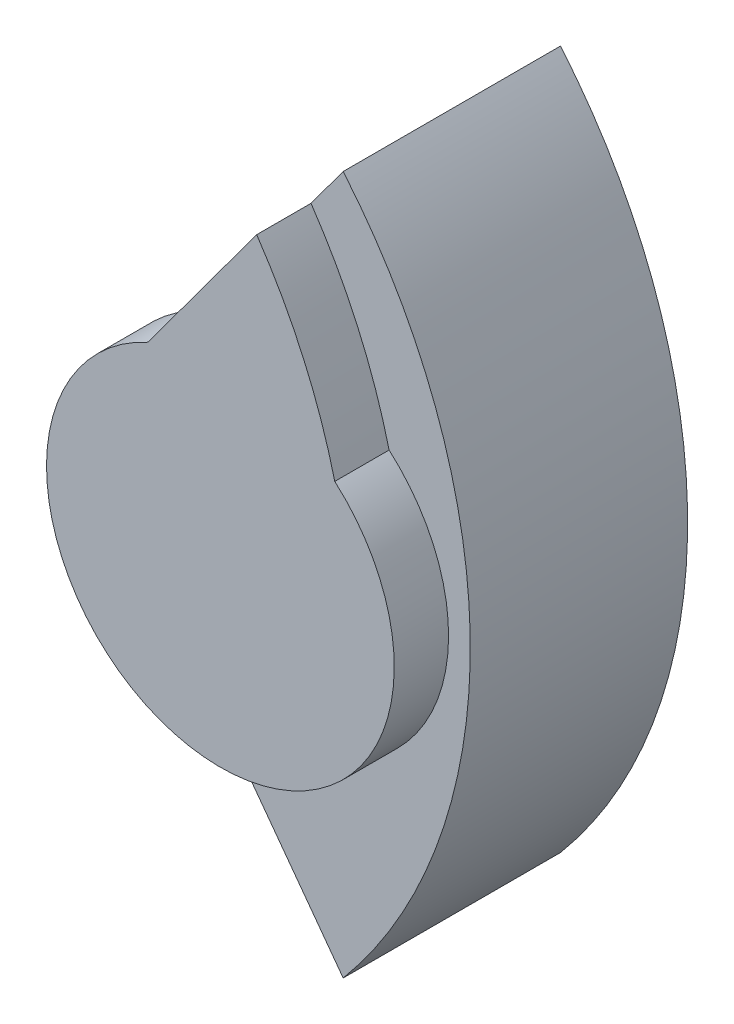
ISO-10303-21;
HEADER;
FILE_DESCRIPTION(('STEP AP214'),'2;1');
FILE_NAME('part.step','',(''),(''),'','','');
FILE_SCHEMA(('AUTOMOTIVE_DESIGN { 1 0 10303 214 1 1 1 1 }'));
ENDSEC;
DATA;
#1=APPLICATION_CONTEXT('core data for automotive mechanical design processes');
#2=APPLICATION_PROTOCOL_DEFINITION('international standard','automotive_design',2000,#1);
#3=PRODUCT_CONTEXT('',#1,'mechanical');
#4=PRODUCT('Part','Part','',(#3));
#5=PRODUCT_RELATED_PRODUCT_CATEGORY('part','',(#4));
#6=PRODUCT_DEFINITION_FORMATION('','',#4);
#7=PRODUCT_DEFINITION_CONTEXT('part definition',#1,'design');
#8=PRODUCT_DEFINITION('design','',#6,#7);
#9=PRODUCT_DEFINITION_SHAPE('','',#8);
#10=(LENGTH_UNIT() NAMED_UNIT(*) SI_UNIT(.MILLI.,.METRE.));
#11=(NAMED_UNIT(*) PLANE_ANGLE_UNIT() SI_UNIT($,.RADIAN.));
#12=(NAMED_UNIT(*) SI_UNIT($,.STERADIAN.) SOLID_ANGLE_UNIT());
#13=UNCERTAINTY_MEASURE_WITH_UNIT(LENGTH_MEASURE(1.E-05),#10,'distance_accuracy_value','');
#14=(GEOMETRIC_REPRESENTATION_CONTEXT(3) GLOBAL_UNCERTAINTY_ASSIGNED_CONTEXT((#13)) GLOBAL_UNIT_ASSIGNED_CONTEXT((#10,
#11,#12)) REPRESENTATION_CONTEXT('',''));
#15=CARTESIAN_POINT('',(0.,0.,0.));
#16=DIRECTION('',(0.,0.,1.));
#17=DIRECTION('',(1.,0.,0.));
#18=AXIS2_PLACEMENT_3D('',#15,#16,#17);
#19=CARTESIAN_POINT('',(32.,0.,5.));
#20=DIRECTION('',(0.,0.,-1.));
#21=DIRECTION('',(-1.,0.,0.));
#22=AXIS2_PLACEMENT_3D('',#19,#20,#21);
#23=CYLINDRICAL_SURFACE('',#22,14.);
#24=CARTESIAN_POINT('',(32.,0.,-20.));
#25=DIRECTION('',(0.,0.,1.));
#26=DIRECTION('',(1.,0.,0.));
#27=AXIS2_PLACEMENT_3D('',#24,#25,#26);
#28=CIRCLE('',#27,14.);
#29=CARTESIAN_POINT('',(46.,0.,-20.));
#30=VERTEX_POINT('',#29);
#31=EDGE_CURVE('E161',#30,#30,#28,.T.);
#32=ORIENTED_EDGE('',*,*,#31,.T.);
#33=EDGE_LOOP('',(#32));
#34=FACE_BOUND('',#33,.T.);
#35=CARTESIAN_POINT('',(32.,0.,0.));
#36=DIRECTION('',(0.,0.,1.));
#37=DIRECTION('',(1.,0.,0.));
#38=AXIS2_PLACEMENT_3D('',#35,#36,#37);
#39=CIRCLE('',#38,14.);
#40=CARTESIAN_POINT('',(20.731628295356,8.30805627845521,0.));
#41=VERTEX_POINT('',#40);
#42=CARTESIAN_POINT('',(20.731628295356,-8.30805627845521,0.));
#43=VERTEX_POINT('',#42);
#44=EDGE_CURVE('E147',#41,#43,#39,.T.);
#45=ORIENTED_EDGE('',*,*,#44,.F.);
#46=DIRECTION('',(0.,0.,1.));
#47=VECTOR('',#46,1.);
#48=CARTESIAN_POINT('',(20.731628295356,8.30805627845521,-3.));
#49=LINE('',#48,#47);
#50=CARTESIAN_POINT('',(20.731628295356,8.30805627845521,-3.));
#51=VERTEX_POINT('',#50);
#52=EDGE_CURVE('E211',#51,#41,#49,.T.);
#53=ORIENTED_EDGE('',*,*,#52,.F.);
#54=CARTESIAN_POINT('',(32.,0.,-3.));
#55=DIRECTION('',(0.,0.,1.));
#56=DIRECTION('',(1.,0.,0.));
#57=AXIS2_PLACEMENT_3D('',#54,#55,#56);
#58=CIRCLE('',#57,14.);
#59=CARTESIAN_POINT('',(20.731628295356,-8.30805627845521,-3.));
#60=VERTEX_POINT('',#59);
#61=EDGE_CURVE('E165',#60,#51,#58,.T.);
#62=ORIENTED_EDGE('',*,*,#61,.F.);
#63=DIRECTION('',(0.,0.,1.));
#64=VECTOR('',#63,1.);
#65=CARTESIAN_POINT('',(20.731628295356,-8.30805627845521,-3.));
#66=LINE('',#65,#64);
#67=EDGE_CURVE('E55',#60,#43,#66,.T.);
#68=ORIENTED_EDGE('',*,*,#67,.T.);
#69=EDGE_LOOP('',(#45,#53,#62,#68));
#70=FACE_BOUND('',#69,.T.);
#71=ADVANCED_FACE('F47',(#34,#70),#23,.T.);
#72=CARTESIAN_POINT('',(0.,0.,0.));
#73=DIRECTION('',(0.,0.,1.));
#74=DIRECTION('',(1.,0.,0.));
#75=AXIS2_PLACEMENT_3D('',#72,#73,#74);
#76=PLANE('',#75);
#77=CARTESIAN_POINT('',(-6.,0.,0.));
#78=DIRECTION('',(0.,0.,1.));
#79=DIRECTION('',(1.,0.,0.));
#80=AXIS2_PLACEMENT_3D('',#77,#78,#79);
#81=CIRCLE('',#80,50.);
#82=CARTESIAN_POINT('',(35.3411099924866,28.1231688219718,0.));
#83=VERTEX_POINT('',#82);
#84=CARTESIAN_POINT('',(42.5263157894737,12.0497583336877,0.));
#85=VERTEX_POINT('',#84);
#86=EDGE_CURVE('E62',#83,#85,#81,.F.);
#87=ORIENTED_EDGE('',*,*,#86,.T.);
#88=CARTESIAN_POINT('',(32.,0.,0.));
#89=DIRECTION('',(0.,0.,1.));
#90=DIRECTION('',(1.,0.,0.));
#91=AXIS2_PLACEMENT_3D('',#88,#89,#90);
#92=CIRCLE('',#91,16.);
#93=CARTESIAN_POINT('',(25.3283373819005,-14.5426585571639,0.));
#94=VERTEX_POINT('',#93);
#95=EDGE_CURVE('E66',#94,#85,#92,.T.);
#96=ORIENTED_EDGE('',*,*,#95,.F.);
#97=DIRECTION('',(-0.593432591318229,0.804883693188855,0.));
#98=VECTOR('',#97,1.);
#99=CARTESIAN_POINT('',(9.46243660131864,6.97655862582796,0.));
#100=LINE('',#99,#98);
#101=CARTESIAN_POINT('',(38.3022221559488,-32.1393804843271,0.));
#102=VERTEX_POINT('',#101);
#103=EDGE_CURVE('E187',#102,#94,#100,.T.);
#104=ORIENTED_EDGE('',*,*,#103,.F.);
#105=CARTESIAN_POINT('',(0.,0.,0.));
#106=DIRECTION('',(0.,0.,1.));
#107=DIRECTION('',(1.,0.,0.));
#108=AXIS2_PLACEMENT_3D('',#105,#106,#107);
#109=CIRCLE('',#108,50.);
#110=CARTESIAN_POINT('',(38.3022221559488,32.1393804843271,0.));
#111=VERTEX_POINT('',#110);
#112=EDGE_CURVE('E203',#111,#102,#109,.F.);
#113=ORIENTED_EDGE('',*,*,#112,.F.);
#114=DIRECTION('',(-0.593432591318229,-0.804883693188855,0.));
#115=VECTOR('',#114,1.);
#116=CARTESIAN_POINT('',(9.46243660131864,-6.97655862582796,0.));
#117=LINE('',#116,#115);
#118=EDGE_CURVE('E196',#111,#83,#117,.T.);
#119=ORIENTED_EDGE('',*,*,#118,.T.);
#120=EDGE_LOOP('',(#87,#96,#104,#113,#119));
#121=FACE_BOUND('',#120,.T.);
#122=ADVANCED_FACE('F226',(#121),#76,.T.);
#123=CARTESIAN_POINT('',(0.,0.,-3.));
#124=DIRECTION('',(0.,0.,1.));
#125=DIRECTION('',(1.,0.,0.));
#126=AXIS2_PLACEMENT_3D('',#123,#124,#125);
#127=PLANE('',#126);
#128=DIRECTION('',(-0.593432591318229,0.804883693188855,0.));
#129=VECTOR('',#128,1.);
#130=CARTESIAN_POINT('',(9.46243660131864,6.97655862582796,-3.));
#131=LINE('',#130,#129);
#132=CARTESIAN_POINT('',(37.349918697773,-30.8477535402281,-3.));
#133=VERTEX_POINT('',#132);
#134=EDGE_CURVE('E191',#133,#60,#131,.T.);
#135=ORIENTED_EDGE('',*,*,#134,.T.);
#136=ORIENTED_EDGE('',*,*,#61,.T.);
#137=DIRECTION('',(-0.593432591318229,-0.804883693188855,0.));
#138=VECTOR('',#137,1.);
#139=CARTESIAN_POINT('',(9.46243660131864,-6.97655862582796,-3.));
#140=LINE('',#139,#138);
#141=CARTESIAN_POINT('',(37.349918697773,30.8477535402281,-3.));
#142=VERTEX_POINT('',#141);
#143=EDGE_CURVE('E195',#142,#51,#140,.T.);
#144=ORIENTED_EDGE('',*,*,#143,.F.);
#145=CARTESIAN_POINT('',(-2.,0.,-3.));
#146=DIRECTION('',(0.,0.,1.));
#147=DIRECTION('',(1.,0.,0.));
#148=AXIS2_PLACEMENT_3D('',#145,#146,#147);
#149=CIRCLE('',#148,50.);
#150=EDGE_CURVE('E11',#142,#133,#149,.F.);
#151=ORIENTED_EDGE('',*,*,#150,.T.);
#152=EDGE_LOOP('',(#135,#136,#144,#151));
#153=FACE_BOUND('',#152,.T.);
#154=ADVANCED_FACE('F246',(#153),#127,.F.);
#155=CARTESIAN_POINT('',(9.46243660131864,6.97655862582796,-3.));
#156=DIRECTION('',(0.804883693188855,0.593432591318229,0.));
#157=DIRECTION('',(-0.593432591318229,0.804883693188855,0.));
#158=AXIS2_PLACEMENT_3D('',#155,#156,#157);
#159=PLANE('',#158);
#160=ORIENTED_EDGE('',*,*,#134,.F.);
#161=DIRECTION('',(0.,0.,1.));
#162=VECTOR('',#161,1.);
#163=CARTESIAN_POINT('',(37.349918697773,-30.8477535402281,-20.));
#164=LINE('',#163,#162);
#165=CARTESIAN_POINT('',(37.349918697773,-30.8477535402281,-20.));
#166=VERTEX_POINT('',#165);
#167=EDGE_CURVE('E184',#166,#133,#164,.T.);
#168=ORIENTED_EDGE('',*,*,#167,.F.);
#169=DIRECTION('',(-0.593432591318229,0.804883693188855,0.));
#170=VECTOR('',#169,1.);
#171=CARTESIAN_POINT('',(9.46243660131864,6.97655862582796,-20.));
#172=LINE('',#171,#170);
#173=CARTESIAN_POINT('',(38.3022221559488,-32.1393804843271,-20.));
#174=VERTEX_POINT('',#173);
#175=EDGE_CURVE('E176',#174,#166,#172,.T.);
#176=ORIENTED_EDGE('',*,*,#175,.F.);
#177=DIRECTION('',(0.,0.,1.));
#178=VECTOR('',#177,1.);
#179=CARTESIAN_POINT('',(38.3022221559488,-32.1393804843271,-3.));
#180=LINE('',#179,#178);
#181=EDGE_CURVE('E200',#174,#102,#180,.T.);
#182=ORIENTED_EDGE('',*,*,#181,.T.);
#183=ORIENTED_EDGE('',*,*,#103,.T.);
#184=DIRECTION('',(0.593432591318229,-0.804883693188855,0.));
#185=VECTOR('',#184,1.);
#186=CARTESIAN_POINT('',(9.46243660131864,6.97655862582796,0.));
#187=LINE('',#186,#185);
#188=EDGE_CURVE('E152',#43,#94,#187,.T.);
#189=ORIENTED_EDGE('',*,*,#188,.F.);
#190=ORIENTED_EDGE('',*,*,#67,.F.);
#191=EDGE_LOOP('',(#160,#168,#176,#182,#183,#189,#190));
#192=FACE_BOUND('',#191,.T.);
#193=ADVANCED_FACE('F221',(#192),#159,.F.);
#194=CARTESIAN_POINT('',(9.46243660131864,-6.97655862582796,-3.));
#195=DIRECTION('',(-0.804883693188855,0.593432591318229,0.));
#196=DIRECTION('',(-0.593432591318229,-0.804883693188855,0.));
#197=AXIS2_PLACEMENT_3D('',#194,#195,#196);
#198=PLANE('',#197);
#199=ORIENTED_EDGE('',*,*,#52,.T.);
#200=CARTESIAN_POINT('',(25.3283373819005,14.5426585571639,0.));
#201=VERTEX_POINT('',#200);
#202=EDGE_CURVE('E144',#201,#41,#117,.T.);
#203=ORIENTED_EDGE('',*,*,#202,.F.);
#204=DIRECTION('',(0.,0.,-1.));
#205=VECTOR('',#204,1.);
#206=CARTESIAN_POINT('',(25.3283373819005,14.5426585571639,5.));
#207=LINE('',#206,#205);
#208=CARTESIAN_POINT('',(25.3283373819005,14.5426585571639,5.));
#209=VERTEX_POINT('',#208);
#210=EDGE_CURVE('E125',#209,#201,#207,.T.);
#211=ORIENTED_EDGE('',*,*,#210,.F.);
#212=DIRECTION('',(-0.593432591318229,-0.804883693188855,0.));
#213=VECTOR('',#212,1.);
#214=CARTESIAN_POINT('',(9.46243660131864,-6.97655862582796,5.));
#215=LINE('',#214,#213);
#216=CARTESIAN_POINT('',(35.3411099924866,28.1231688219718,5.));
#217=VERTEX_POINT('',#216);
#218=EDGE_CURVE('E133',#217,#209,#215,.T.);
#219=ORIENTED_EDGE('',*,*,#218,.F.);
#220=DIRECTION('',(0.,0.,-1.));
#221=VECTOR('',#220,1.);
#222=CARTESIAN_POINT('',(35.3411099924866,28.1231688219718,5.));
#223=LINE('',#222,#221);
#224=EDGE_CURVE('E154',#217,#83,#223,.T.);
#225=ORIENTED_EDGE('',*,*,#224,.T.);
#226=ORIENTED_EDGE('',*,*,#118,.F.);
#227=DIRECTION('',(0.,0.,1.));
#228=VECTOR('',#227,1.);
#229=CARTESIAN_POINT('',(38.3022221559488,32.1393804843271,-3.));
#230=LINE('',#229,#228);
#231=CARTESIAN_POINT('',(38.3022221559488,32.1393804843271,-20.));
#232=VERTEX_POINT('',#231);
#233=EDGE_CURVE('E214',#232,#111,#230,.T.);
#234=ORIENTED_EDGE('',*,*,#233,.F.);
#235=DIRECTION('',(-0.593432591318229,-0.804883693188855,0.));
#236=VECTOR('',#235,1.);
#237=CARTESIAN_POINT('',(9.46243660131864,-6.97655862582796,-20.));
#238=LINE('',#237,#236);
#239=CARTESIAN_POINT('',(37.349918697773,30.8477535402281,-20.));
#240=VERTEX_POINT('',#239);
#241=EDGE_CURVE('E168',#232,#240,#238,.T.);
#242=ORIENTED_EDGE('',*,*,#241,.T.);
#243=DIRECTION('',(0.,0.,1.));
#244=VECTOR('',#243,1.);
#245=CARTESIAN_POINT('',(37.349918697773,30.8477535402281,-20.));
#246=LINE('',#245,#244);
#247=EDGE_CURVE('E183',#240,#142,#246,.T.);
#248=ORIENTED_EDGE('',*,*,#247,.T.);
#249=ORIENTED_EDGE('',*,*,#143,.T.);
#250=EDGE_LOOP('',(#199,#203,#211,#219,#225,#226,#234,#242,#248,#249));
#251=FACE_BOUND('',#250,.T.);
#252=ADVANCED_FACE('F142',(#251),#198,.T.);
#253=CARTESIAN_POINT('',(0.,0.,-3.));
#254=DIRECTION('',(0.,0.,1.));
#255=DIRECTION('',(1.,0.,0.));
#256=AXIS2_PLACEMENT_3D('',#253,#254,#255);
#257=CYLINDRICAL_SURFACE('',#256,50.);
#258=ORIENTED_EDGE('',*,*,#112,.T.);
#259=ORIENTED_EDGE('',*,*,#181,.F.);
#260=CARTESIAN_POINT('',(0.,0.,-20.));
#261=DIRECTION('',(0.,0.,1.));
#262=DIRECTION('',(1.,0.,0.));
#263=AXIS2_PLACEMENT_3D('',#260,#261,#262);
#264=CIRCLE('',#263,50.);
#265=EDGE_CURVE('E179',#232,#174,#264,.F.);
#266=ORIENTED_EDGE('',*,*,#265,.F.);
#267=ORIENTED_EDGE('',*,*,#233,.T.);
#268=EDGE_LOOP('',(#258,#259,#266,#267));
#269=FACE_BOUND('',#268,.T.);
#270=ADVANCED_FACE('F253',(#269),#257,.T.);
#271=CARTESIAN_POINT('',(-2.,0.,-20.));
#272=DIRECTION('',(0.,0.,1.));
#273=DIRECTION('',(1.,0.,0.));
#274=AXIS2_PLACEMENT_3D('',#271,#272,#273);
#275=CYLINDRICAL_SURFACE('',#274,50.);
#276=ORIENTED_EDGE('',*,*,#150,.F.);
#277=ORIENTED_EDGE('',*,*,#247,.F.);
#278=CARTESIAN_POINT('',(-2.,0.,-20.));
#279=DIRECTION('',(0.,0.,1.));
#280=DIRECTION('',(1.,0.,0.));
#281=AXIS2_PLACEMENT_3D('',#278,#279,#280);
#282=CIRCLE('',#281,50.);
#283=EDGE_CURVE('E172',#240,#166,#282,.F.);
#284=ORIENTED_EDGE('',*,*,#283,.T.);
#285=ORIENTED_EDGE('',*,*,#167,.T.);
#286=EDGE_LOOP('',(#276,#277,#284,#285));
#287=FACE_BOUND('',#286,.T.);
#288=ADVANCED_FACE('F249',(#287),#275,.F.);
#289=CARTESIAN_POINT('',(0.,0.,-20.));
#290=DIRECTION('',(0.,0.,1.));
#291=DIRECTION('',(1.,0.,0.));
#292=AXIS2_PLACEMENT_3D('',#289,#290,#291);
#293=PLANE('',#292);
#294=ORIENTED_EDGE('',*,*,#241,.F.);
#295=ORIENTED_EDGE('',*,*,#265,.T.);
#296=ORIENTED_EDGE('',*,*,#175,.T.);
#297=ORIENTED_EDGE('',*,*,#283,.F.);
#298=EDGE_LOOP('',(#294,#295,#296,#297));
#299=FACE_BOUND('',#298,.T.);
#300=ADVANCED_FACE('F252',(#299),#293,.F.);
#301=CARTESIAN_POINT('',(32.,0.,-20.));
#302=DIRECTION('',(0.,0.,1.));
#303=DIRECTION('',(1.,0.,0.));
#304=AXIS2_PLACEMENT_3D('',#301,#302,#303);
#305=PLANE('',#304);
#306=ORIENTED_EDGE('',*,*,#31,.F.);
#307=EDGE_LOOP('',(#306));
#308=FACE_BOUND('',#307,.T.);
#309=ADVANCED_FACE('F272',(#308),#305,.F.);
#310=CARTESIAN_POINT('',(0.,0.,0.));
#311=DIRECTION('',(0.,0.,1.));
#312=DIRECTION('',(1.,0.,0.));
#313=AXIS2_PLACEMENT_3D('',#310,#311,#312);
#314=PLANE('',#313);
#315=ORIENTED_EDGE('',*,*,#44,.T.);
#316=ORIENTED_EDGE('',*,*,#188,.T.);
#317=EDGE_CURVE('E232',#201,#94,#92,.T.);
#318=ORIENTED_EDGE('',*,*,#317,.F.);
#319=ORIENTED_EDGE('',*,*,#202,.T.);
#320=EDGE_LOOP('',(#315,#316,#318,#319));
#321=FACE_BOUND('',#320,.T.);
#322=ADVANCED_FACE('F240',(#321),#314,.F.);
#323=CARTESIAN_POINT('',(32.,0.,5.));
#324=DIRECTION('',(0.,0.,-1.));
#325=DIRECTION('',(-1.,0.,0.));
#326=AXIS2_PLACEMENT_3D('',#323,#324,#325);
#327=CYLINDRICAL_SURFACE('',#326,16.);
#328=ORIENTED_EDGE('',*,*,#317,.T.);
#329=ORIENTED_EDGE('',*,*,#95,.T.);
#330=DIRECTION('',(0.,0.,-1.));
#331=VECTOR('',#330,1.);
#332=CARTESIAN_POINT('',(42.5263157894737,12.0497583336877,5.));
#333=LINE('',#332,#331);
#334=CARTESIAN_POINT('',(42.5263157894737,12.0497583336877,5.));
#335=VERTEX_POINT('',#334);
#336=EDGE_CURVE('E127',#335,#85,#333,.T.);
#337=ORIENTED_EDGE('',*,*,#336,.F.);
#338=CARTESIAN_POINT('',(32.,0.,5.));
#339=DIRECTION('',(0.,0.,1.));
#340=DIRECTION('',(1.,0.,0.));
#341=AXIS2_PLACEMENT_3D('',#338,#339,#340);
#342=CIRCLE('',#341,16.);
#343=EDGE_CURVE('E120',#209,#335,#342,.T.);
#344=ORIENTED_EDGE('',*,*,#343,.F.);
#345=ORIENTED_EDGE('',*,*,#210,.T.);
#346=EDGE_LOOP('',(#328,#329,#337,#344,#345));
#347=FACE_BOUND('',#346,.T.);
#348=ADVANCED_FACE('F123',(#347),#327,.T.);
#349=CARTESIAN_POINT('',(-6.,0.,5.));
#350=DIRECTION('',(0.,0.,-1.));
#351=DIRECTION('',(-1.,0.,0.));
#352=AXIS2_PLACEMENT_3D('',#349,#350,#351);
#353=CYLINDRICAL_SURFACE('',#352,50.);
#354=ORIENTED_EDGE('',*,*,#86,.F.);
#355=ORIENTED_EDGE('',*,*,#224,.F.);
#356=CARTESIAN_POINT('',(-6.,0.,5.));
#357=DIRECTION('',(0.,0.,1.));
#358=DIRECTION('',(1.,0.,0.));
#359=AXIS2_PLACEMENT_3D('',#356,#357,#358);
#360=CIRCLE('',#359,50.);
#361=EDGE_CURVE('E132',#217,#335,#360,.F.);
#362=ORIENTED_EDGE('',*,*,#361,.T.);
#363=ORIENTED_EDGE('',*,*,#336,.T.);
#364=EDGE_LOOP('',(#354,#355,#362,#363));
#365=FACE_BOUND('',#364,.T.);
#366=ADVANCED_FACE('F230',(#365),#353,.T.);
#367=CARTESIAN_POINT('',(32.,0.,5.));
#368=DIRECTION('',(0.,0.,1.));
#369=DIRECTION('',(1.,0.,0.));
#370=AXIS2_PLACEMENT_3D('',#367,#368,#369);
#371=PLANE('',#370);
#372=ORIENTED_EDGE('',*,*,#218,.T.);
#373=ORIENTED_EDGE('',*,*,#343,.T.);
#374=ORIENTED_EDGE('',*,*,#361,.F.);
#375=EDGE_LOOP('',(#372,#373,#374));
#376=FACE_BOUND('',#375,.T.);
#377=ADVANCED_FACE('F136',(#376),#371,.T.);
#378=CLOSED_SHELL('',(#71,#122,#154,#193,#252,#270,#288,#300,#309,#322,#348,#366,#377));
#379=MANIFOLD_SOLID_BREP('B2',#378);
#380=ADVANCED_BREP_SHAPE_REPRESENTATION('',(#18,#379),#14);
#381=SHAPE_DEFINITION_REPRESENTATION(#9,#380);
ENDSEC;
END-ISO-10303-21;
